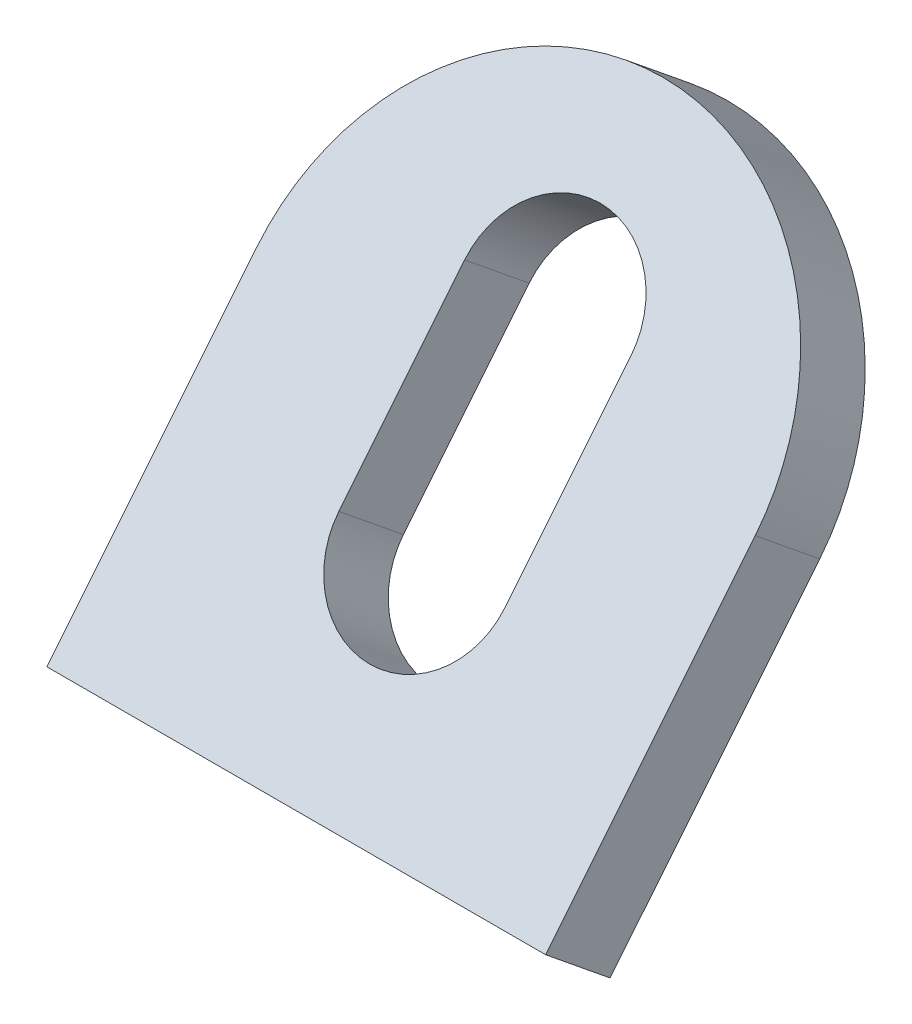
ISO-10303-21;
HEADER;
FILE_DESCRIPTION(('STEP AP214'),'2;1');
FILE_NAME('part.step','',(''),(''),'','','');
FILE_SCHEMA(('AUTOMOTIVE_DESIGN { 1 0 10303 214 1 1 1 1 }'));
ENDSEC;
DATA;
#1=APPLICATION_CONTEXT('core data for automotive mechanical design processes');
#2=APPLICATION_PROTOCOL_DEFINITION('international standard','automotive_design',2000,#1);
#3=PRODUCT_CONTEXT('',#1,'mechanical');
#4=PRODUCT('Part','Part','',(#3));
#5=PRODUCT_RELATED_PRODUCT_CATEGORY('part','',(#4));
#6=PRODUCT_DEFINITION_FORMATION('','',#4);
#7=PRODUCT_DEFINITION_CONTEXT('part definition',#1,'design');
#8=PRODUCT_DEFINITION('design','',#6,#7);
#9=PRODUCT_DEFINITION_SHAPE('','',#8);
#10=(LENGTH_UNIT() NAMED_UNIT(*) SI_UNIT(.MILLI.,.METRE.));
#11=(NAMED_UNIT(*) PLANE_ANGLE_UNIT() SI_UNIT($,.RADIAN.));
#12=(NAMED_UNIT(*) SI_UNIT($,.STERADIAN.) SOLID_ANGLE_UNIT());
#13=UNCERTAINTY_MEASURE_WITH_UNIT(LENGTH_MEASURE(1.E-05),#10,'distance_accuracy_value','');
#14=(GEOMETRIC_REPRESENTATION_CONTEXT(3) GLOBAL_UNCERTAINTY_ASSIGNED_CONTEXT((#13)) GLOBAL_UNIT_ASSIGNED_CONTEXT((#10,
#11,#12)) REPRESENTATION_CONTEXT('',''));
#15=CARTESIAN_POINT('',(0.,0.,0.));
#16=DIRECTION('',(0.,0.,1.));
#17=DIRECTION('',(1.,0.,0.));
#18=AXIS2_PLACEMENT_3D('',#15,#16,#17);
#19=CARTESIAN_POINT('',(-214.196349790337,456.804813424212,-149.20303301451));
#20=DIRECTION('',(0.,-0.630511996261592,-0.776179504090531));
#21=DIRECTION('',(0.,0.776179504090531,-0.630511996261592));
#22=AXIS2_PLACEMENT_3D('',#19,#20,#21);
#23=PLANE('',#22);
#24=DIRECTION('',(0.,0.776179504090531,-0.630511996261591));
#25=VECTOR('',#24,1.);
#26=CARTESIAN_POINT('',(-223.721349790337,446.947333722262,-141.195530661988));
#27=LINE('',#26,#25);
#28=CARTESIAN_POINT('',(-223.721349790337,446.947333722262,-141.195530661988));
#29=VERTEX_POINT('',#28);
#30=CARTESIAN_POINT('',(-223.721349790337,456.804813424212,-149.20303301451));
#31=VERTEX_POINT('',#30);
#32=EDGE_CURVE('E140',#29,#31,#27,.T.);
#33=ORIENTED_EDGE('',*,*,#32,.T.);
#34=CARTESIAN_POINT('',(-214.196349790337,456.804813424212,-149.20303301451));
#35=DIRECTION('',(0.,-0.630511996261592,-0.776179504090531));
#36=DIRECTION('',(0.,0.776179504090531,-0.630511996261592));
#37=AXIS2_PLACEMENT_3D('',#34,#35,#36);
#38=CIRCLE('',#37,9.52500000000003);
#39=CARTESIAN_POINT('',(-204.671349790337,456.804813424212,-149.20303301451));
#40=VERTEX_POINT('',#39);
#41=EDGE_CURVE('E143',#31,#40,#38,.T.);
#42=ORIENTED_EDGE('',*,*,#41,.T.);
#43=DIRECTION('',(0.,-0.776179504090531,0.630511996261591));
#44=VECTOR('',#43,1.);
#45=CARTESIAN_POINT('',(-204.671349790337,446.947333722262,-141.195530661988));
#46=LINE('',#45,#44);
#47=CARTESIAN_POINT('',(-204.671349790337,446.947333722262,-141.195530661988));
#48=VERTEX_POINT('',#47);
#49=EDGE_CURVE('E146',#40,#48,#46,.T.);
#50=ORIENTED_EDGE('',*,*,#49,.T.);
#51=DIRECTION('',(-1.,0.,0.));
#52=VECTOR('',#51,1.);
#53=CARTESIAN_POINT('',(-223.721349790337,446.947333722262,-141.195530661988));
#54=LINE('',#53,#52);
#55=EDGE_CURVE('E148',#48,#29,#54,.T.);
#56=ORIENTED_EDGE('',*,*,#55,.T.);
#57=EDGE_LOOP('',(#33,#42,#50,#56));
#58=FACE_BOUND('',#57,.T.);
#59=DIRECTION('',(0.,0.776179504090529,-0.630511996261594));
#60=VECTOR('',#59,1.);
#61=CARTESIAN_POINT('',(-217.371349790337,452.861821543432,-146.000032073501));
#62=LINE('',#61,#60);
#63=CARTESIAN_POINT('',(-217.371349790337,452.861821543432,-146.000032073501));
#64=VERTEX_POINT('',#63);
#65=CARTESIAN_POINT('',(-217.371349790337,458.776309364602,-150.804533485015));
#66=VERTEX_POINT('',#65);
#67=EDGE_CURVE('E112',#64,#66,#62,.T.);
#68=ORIENTED_EDGE('',*,*,#67,.F.);
#69=CARTESIAN_POINT('',(-214.196349790337,452.861821543432,-146.000032073501));
#70=DIRECTION('',(0.,-0.630511996261592,-0.776179504090531));
#71=DIRECTION('',(0.,0.776179504090531,-0.630511996261592));
#72=AXIS2_PLACEMENT_3D('',#69,#70,#71);
#73=CIRCLE('',#72,3.17500000000001);
#74=CARTESIAN_POINT('',(-211.021349790337,452.861821543432,-146.000032073501));
#75=VERTEX_POINT('',#74);
#76=EDGE_CURVE('E104',#75,#64,#73,.T.);
#77=ORIENTED_EDGE('',*,*,#76,.F.);
#78=DIRECTION('',(0.,-0.776179504090529,0.630511996261594));
#79=VECTOR('',#78,1.);
#80=CARTESIAN_POINT('',(-211.021349790337,458.776309364602,-150.804533485015));
#81=LINE('',#80,#79);
#82=CARTESIAN_POINT('',(-211.021349790337,458.776309364602,-150.804533485015));
#83=VERTEX_POINT('',#82);
#84=EDGE_CURVE('E126',#83,#75,#81,.T.);
#85=ORIENTED_EDGE('',*,*,#84,.F.);
#86=CARTESIAN_POINT('',(-214.196349790337,458.776309364602,-150.804533485015));
#87=DIRECTION('',(0.,-0.630511996261592,-0.776179504090531));
#88=DIRECTION('',(0.,0.776179504090531,-0.630511996261592));
#89=AXIS2_PLACEMENT_3D('',#86,#87,#88);
#90=CIRCLE('',#89,3.17500000000001);
#91=EDGE_CURVE('E124',#66,#83,#90,.T.);
#92=ORIENTED_EDGE('',*,*,#91,.F.);
#93=EDGE_LOOP('',(#68,#77,#85,#92));
#94=FACE_BOUND('',#93,.T.);
#95=ADVANCED_FACE('F39',(#58,#94),#23,.T.);
#96=CARTESIAN_POINT('',(-214.196349790337,458.806689012343,-146.738663089023));
#97=DIRECTION('',(0.,-0.630511996261592,-0.776179504090531));
#98=DIRECTION('',(0.,0.776179504090531,-0.630511996261592));
#99=AXIS2_PLACEMENT_3D('',#96,#97,#98);
#100=PLANE('',#99);
#101=DIRECTION('',(0.,0.776179504090531,-0.630511996261591));
#102=VECTOR('',#101,1.);
#103=CARTESIAN_POINT('',(-223.721349790337,448.949209310393,-138.7311607365));
#104=LINE('',#103,#102);
#105=CARTESIAN_POINT('',(-223.721349790337,448.949209310393,-138.7311607365));
#106=VERTEX_POINT('',#105);
#107=CARTESIAN_POINT('',(-223.721349790337,458.806689012343,-146.738663089023));
#108=VERTEX_POINT('',#107);
#109=EDGE_CURVE('E120',#106,#108,#104,.T.);
#110=ORIENTED_EDGE('',*,*,#109,.F.);
#111=DIRECTION('',(-1.,0.,0.));
#112=VECTOR('',#111,1.);
#113=CARTESIAN_POINT('',(-223.721349790337,448.949209310393,-138.7311607365));
#114=LINE('',#113,#112);
#115=CARTESIAN_POINT('',(-204.671349790337,448.949209310393,-138.7311607365));
#116=VERTEX_POINT('',#115);
#117=EDGE_CURVE('E144',#116,#106,#114,.T.);
#118=ORIENTED_EDGE('',*,*,#117,.F.);
#119=DIRECTION('',(0.,-0.776179504090531,0.630511996261591));
#120=VECTOR('',#119,1.);
#121=CARTESIAN_POINT('',(-204.671349790337,448.949209310393,-138.7311607365));
#122=LINE('',#121,#120);
#123=CARTESIAN_POINT('',(-204.671349790337,458.806689012343,-146.738663089023));
#124=VERTEX_POINT('',#123);
#125=EDGE_CURVE('E155',#124,#116,#122,.T.);
#126=ORIENTED_EDGE('',*,*,#125,.F.);
#127=CARTESIAN_POINT('',(-214.196349790337,458.806689012343,-146.738663089023));
#128=DIRECTION('',(0.,-0.630511996261592,-0.776179504090531));
#129=DIRECTION('',(0.,0.776179504090531,-0.630511996261592));
#130=AXIS2_PLACEMENT_3D('',#127,#128,#129);
#131=CIRCLE('',#130,9.52500000000003);
#132=EDGE_CURVE('E153',#108,#124,#131,.T.);
#133=ORIENTED_EDGE('',*,*,#132,.F.);
#134=EDGE_LOOP('',(#110,#118,#126,#133));
#135=FACE_BOUND('',#134,.T.);
#136=CARTESIAN_POINT('',(-214.196349790337,454.863697131563,-143.535662148014));
#137=DIRECTION('',(0.,-0.630511996261592,-0.776179504090531));
#138=DIRECTION('',(0.,0.776179504090531,-0.630511996261592));
#139=AXIS2_PLACEMENT_3D('',#136,#137,#138);
#140=CIRCLE('',#139,3.17500000000001);
#141=CARTESIAN_POINT('',(-211.021349790337,454.863697131563,-143.535662148014));
#142=VERTEX_POINT('',#141);
#143=CARTESIAN_POINT('',(-217.371349790337,454.863697131563,-143.535662148014));
#144=VERTEX_POINT('',#143);
#145=EDGE_CURVE('E62',#142,#144,#140,.T.);
#146=ORIENTED_EDGE('',*,*,#145,.T.);
#147=DIRECTION('',(0.,0.776179504090529,-0.630511996261594));
#148=VECTOR('',#147,1.);
#149=CARTESIAN_POINT('',(-217.371349790337,454.863697131563,-143.535662148014));
#150=LINE('',#149,#148);
#151=CARTESIAN_POINT('',(-217.371349790337,460.778184952733,-148.340163559527));
#152=VERTEX_POINT('',#151);
#153=EDGE_CURVE('E119',#144,#152,#150,.T.);
#154=ORIENTED_EDGE('',*,*,#153,.T.);
#155=CARTESIAN_POINT('',(-214.196349790337,460.778184952733,-148.340163559527));
#156=DIRECTION('',(0.,-0.630511996261592,-0.776179504090531));
#157=DIRECTION('',(0.,0.776179504090531,-0.630511996261592));
#158=AXIS2_PLACEMENT_3D('',#155,#156,#157);
#159=CIRCLE('',#158,3.17500000000001);
#160=CARTESIAN_POINT('',(-211.021349790337,460.778184952733,-148.340163559527));
#161=VERTEX_POINT('',#160);
#162=EDGE_CURVE('E132',#152,#161,#159,.T.);
#163=ORIENTED_EDGE('',*,*,#162,.T.);
#164=DIRECTION('',(0.,-0.776179504090529,0.630511996261594));
#165=VECTOR('',#164,1.);
#166=CARTESIAN_POINT('',(-211.021349790337,460.778184952733,-148.340163559527));
#167=LINE('',#166,#165);
#168=EDGE_CURVE('E113',#161,#142,#167,.T.);
#169=ORIENTED_EDGE('',*,*,#168,.T.);
#170=EDGE_LOOP('',(#146,#154,#163,#169));
#171=FACE_BOUND('',#170,.T.);
#172=ADVANCED_FACE('F173',(#135,#171),#100,.F.);
#173=CARTESIAN_POINT('',(-223.721349790337,446.947333722262,-141.195530661988));
#174=DIRECTION('',(1.,0.,0.));
#175=DIRECTION('',(0.,1.,0.));
#176=AXIS2_PLACEMENT_3D('',#173,#174,#175);
#177=PLANE('',#176);
#178=ORIENTED_EDGE('',*,*,#109,.T.);
#179=DIRECTION('',(0.,0.630511996261592,0.776179504090531));
#180=VECTOR('',#179,1.);
#181=CARTESIAN_POINT('',(-223.721349790337,456.804813424212,-149.20303301451));
#182=LINE('',#181,#180);
#183=EDGE_CURVE('E11',#31,#108,#182,.T.);
#184=ORIENTED_EDGE('',*,*,#183,.F.);
#185=ORIENTED_EDGE('',*,*,#32,.F.);
#186=DIRECTION('',(0.,0.630511996261592,0.776179504090531));
#187=VECTOR('',#186,1.);
#188=CARTESIAN_POINT('',(-223.721349790337,446.947333722262,-141.195530661988));
#189=LINE('',#188,#187);
#190=EDGE_CURVE('E150',#29,#106,#189,.T.);
#191=ORIENTED_EDGE('',*,*,#190,.T.);
#192=EDGE_LOOP('',(#178,#184,#185,#191));
#193=FACE_BOUND('',#192,.T.);
#194=ADVANCED_FACE('F41',(#193),#177,.F.);
#195=CARTESIAN_POINT('',(-214.196349790337,456.804813424212,-149.20303301451));
#196=DIRECTION('',(0.,0.630511996261592,0.776179504090531));
#197=DIRECTION('',(0.,-0.776179504090531,0.630511996261592));
#198=AXIS2_PLACEMENT_3D('',#195,#196,#197);
#199=CYLINDRICAL_SURFACE('',#198,9.52500000000003);
#200=ORIENTED_EDGE('',*,*,#132,.T.);
#201=DIRECTION('',(0.,0.630511996261592,0.776179504090531));
#202=VECTOR('',#201,1.);
#203=CARTESIAN_POINT('',(-204.671349790337,456.804813424212,-149.20303301451));
#204=LINE('',#203,#202);
#205=EDGE_CURVE('E47',#40,#124,#204,.T.);
#206=ORIENTED_EDGE('',*,*,#205,.F.);
#207=ORIENTED_EDGE('',*,*,#41,.F.);
#208=ORIENTED_EDGE('',*,*,#183,.T.);
#209=EDGE_LOOP('',(#200,#206,#207,#208));
#210=FACE_BOUND('',#209,.T.);
#211=ADVANCED_FACE('F183',(#210),#199,.T.);
#212=CARTESIAN_POINT('',(-204.671349790337,446.947333722262,-141.195530661988));
#213=DIRECTION('',(-1.,0.,0.));
#214=DIRECTION('',(0.,-1.,0.));
#215=AXIS2_PLACEMENT_3D('',#212,#213,#214);
#216=PLANE('',#215);
#217=ORIENTED_EDGE('',*,*,#125,.T.);
#218=DIRECTION('',(0.,0.630511996261592,0.776179504090531));
#219=VECTOR('',#218,1.);
#220=CARTESIAN_POINT('',(-204.671349790337,446.947333722262,-141.195530661988));
#221=LINE('',#220,#219);
#222=EDGE_CURVE('E160',#48,#116,#221,.T.);
#223=ORIENTED_EDGE('',*,*,#222,.F.);
#224=ORIENTED_EDGE('',*,*,#49,.F.);
#225=ORIENTED_EDGE('',*,*,#205,.T.);
#226=EDGE_LOOP('',(#217,#223,#224,#225));
#227=FACE_BOUND('',#226,.T.);
#228=ADVANCED_FACE('F167',(#227),#216,.F.);
#229=CARTESIAN_POINT('',(-223.721349790337,446.947333722262,-141.195530661988));
#230=DIRECTION('',(0.,0.776179504090531,-0.630511996261592));
#231=DIRECTION('',(0.,0.630511996261592,0.776179504090531));
#232=AXIS2_PLACEMENT_3D('',#229,#230,#231);
#233=PLANE('',#232);
#234=ORIENTED_EDGE('',*,*,#117,.T.);
#235=ORIENTED_EDGE('',*,*,#190,.F.);
#236=ORIENTED_EDGE('',*,*,#55,.F.);
#237=ORIENTED_EDGE('',*,*,#222,.T.);
#238=EDGE_LOOP('',(#234,#235,#236,#237));
#239=FACE_BOUND('',#238,.T.);
#240=ADVANCED_FACE('F177',(#239),#233,.F.);
#241=CARTESIAN_POINT('',(-214.196349790337,452.861821543432,-146.000032073501));
#242=DIRECTION('',(0.,0.630511996261592,0.776179504090531));
#243=DIRECTION('',(0.,-0.776179504090531,0.630511996261592));
#244=AXIS2_PLACEMENT_3D('',#241,#242,#243);
#245=CYLINDRICAL_SURFACE('',#244,3.17500000000001);
#246=ORIENTED_EDGE('',*,*,#145,.F.);
#247=DIRECTION('',(0.,0.630511996261592,0.776179504090531));
#248=VECTOR('',#247,1.);
#249=CARTESIAN_POINT('',(-211.021349790337,452.861821543432,-146.000032073501));
#250=LINE('',#249,#248);
#251=EDGE_CURVE('E108',#75,#142,#250,.T.);
#252=ORIENTED_EDGE('',*,*,#251,.F.);
#253=ORIENTED_EDGE('',*,*,#76,.T.);
#254=DIRECTION('',(0.,0.630511996261592,0.776179504090531));
#255=VECTOR('',#254,1.);
#256=CARTESIAN_POINT('',(-217.371349790337,452.861821543432,-146.000032073501));
#257=LINE('',#256,#255);
#258=EDGE_CURVE('E107',#64,#144,#257,.T.);
#259=ORIENTED_EDGE('',*,*,#258,.T.);
#260=EDGE_LOOP('',(#246,#252,#253,#259));
#261=FACE_BOUND('',#260,.T.);
#262=ADVANCED_FACE('F106',(#261),#245,.F.);
#263=CARTESIAN_POINT('',(-217.371349790337,452.861821543432,-146.000032073501));
#264=DIRECTION('',(1.,0.,0.));
#265=DIRECTION('',(0.,0.,-1.));
#266=AXIS2_PLACEMENT_3D('',#263,#264,#265);
#267=PLANE('',#266);
#268=ORIENTED_EDGE('',*,*,#153,.F.);
#269=ORIENTED_EDGE('',*,*,#258,.F.);
#270=ORIENTED_EDGE('',*,*,#67,.T.);
#271=DIRECTION('',(0.,0.630511996261592,0.776179504090531));
#272=VECTOR('',#271,1.);
#273=CARTESIAN_POINT('',(-217.371349790337,458.776309364602,-150.804533485015));
#274=LINE('',#273,#272);
#275=EDGE_CURVE('E121',#66,#152,#274,.T.);
#276=ORIENTED_EDGE('',*,*,#275,.T.);
#277=EDGE_LOOP('',(#268,#269,#270,#276));
#278=FACE_BOUND('',#277,.T.);
#279=ADVANCED_FACE('F116',(#278),#267,.T.);
#280=CARTESIAN_POINT('',(-214.196349790337,458.776309364602,-150.804533485015));
#281=DIRECTION('',(0.,0.630511996261592,0.776179504090531));
#282=DIRECTION('',(0.,-0.776179504090531,0.630511996261592));
#283=AXIS2_PLACEMENT_3D('',#280,#281,#282);
#284=CYLINDRICAL_SURFACE('',#283,3.17500000000001);
#285=ORIENTED_EDGE('',*,*,#162,.F.);
#286=ORIENTED_EDGE('',*,*,#275,.F.);
#287=ORIENTED_EDGE('',*,*,#91,.T.);
#288=DIRECTION('',(0.,0.630511996261592,0.776179504090531));
#289=VECTOR('',#288,1.);
#290=CARTESIAN_POINT('',(-211.021349790337,458.776309364602,-150.804533485015));
#291=LINE('',#290,#289);
#292=EDGE_CURVE('E54',#83,#161,#291,.T.);
#293=ORIENTED_EDGE('',*,*,#292,.T.);
#294=EDGE_LOOP('',(#285,#286,#287,#293));
#295=FACE_BOUND('',#294,.T.);
#296=ADVANCED_FACE('F206',(#295),#284,.F.);
#297=CARTESIAN_POINT('',(-211.021349790337,458.776309364602,-150.804533485015));
#298=DIRECTION('',(-1.,0.,0.));
#299=DIRECTION('',(0.,0.,1.));
#300=AXIS2_PLACEMENT_3D('',#297,#298,#299);
#301=PLANE('',#300);
#302=ORIENTED_EDGE('',*,*,#168,.F.);
#303=ORIENTED_EDGE('',*,*,#292,.F.);
#304=ORIENTED_EDGE('',*,*,#84,.T.);
#305=ORIENTED_EDGE('',*,*,#251,.T.);
#306=EDGE_LOOP('',(#302,#303,#304,#305));
#307=FACE_BOUND('',#306,.T.);
#308=ADVANCED_FACE('F210',(#307),#301,.T.);
#309=CLOSED_SHELL('',(#95,#172,#194,#211,#228,#240,#262,#279,#296,#308));
#310=MANIFOLD_SOLID_BREP('B2',#309);
#311=ADVANCED_BREP_SHAPE_REPRESENTATION('',(#18,#310),#14);
#312=SHAPE_DEFINITION_REPRESENTATION(#9,#311);
ENDSEC;
END-ISO-10303-21;
